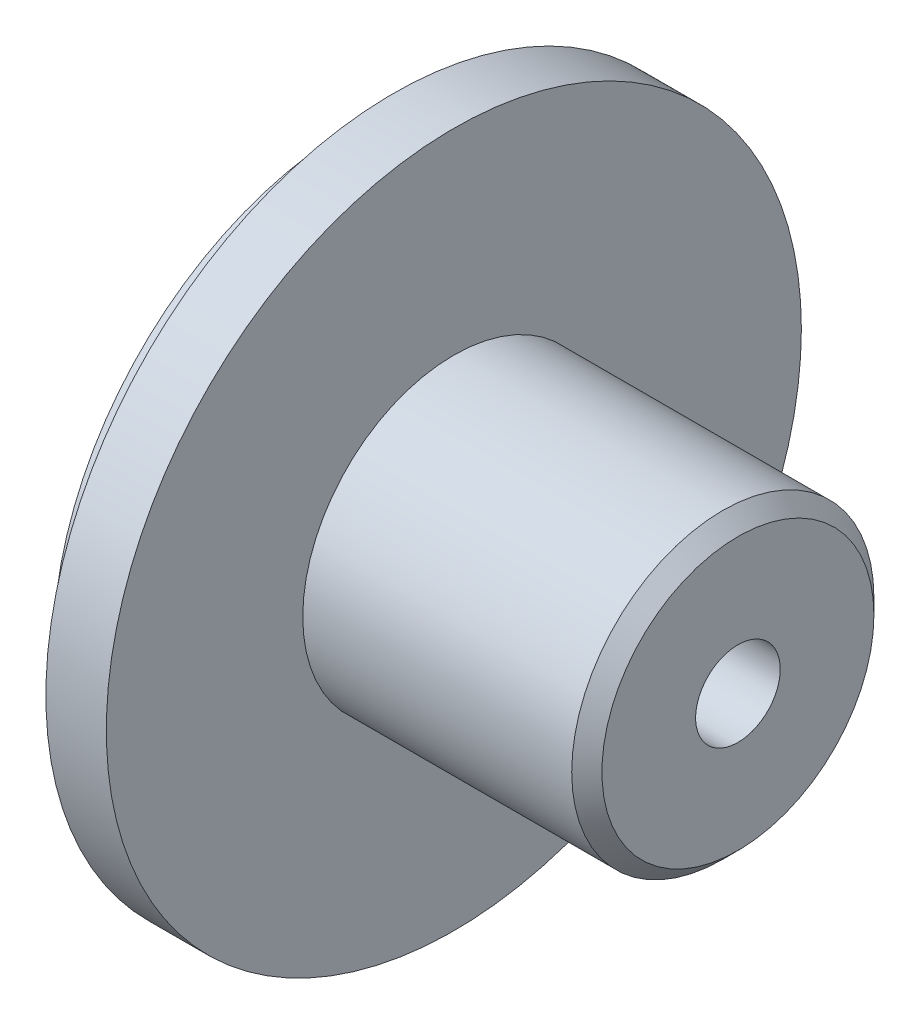
ISO-10303-21;
HEADER;
FILE_DESCRIPTION(('STEP AP214'),'2;1');
FILE_NAME('part.step','',(''),(''),'','','');
FILE_SCHEMA(('AUTOMOTIVE_DESIGN { 1 0 10303 214 1 1 1 1 }'));
ENDSEC;
DATA;
#1=APPLICATION_CONTEXT('core data for automotive mechanical design processes');
#2=APPLICATION_PROTOCOL_DEFINITION('international standard','automotive_design',2000,#1);
#3=PRODUCT_CONTEXT('',#1,'mechanical');
#4=PRODUCT('Part','Part','',(#3));
#5=PRODUCT_RELATED_PRODUCT_CATEGORY('part','',(#4));
#6=PRODUCT_DEFINITION_FORMATION('','',#4);
#7=PRODUCT_DEFINITION_CONTEXT('part definition',#1,'design');
#8=PRODUCT_DEFINITION('design','',#6,#7);
#9=PRODUCT_DEFINITION_SHAPE('','',#8);
#10=(LENGTH_UNIT() NAMED_UNIT(*) SI_UNIT(.MILLI.,.METRE.));
#11=(NAMED_UNIT(*) PLANE_ANGLE_UNIT() SI_UNIT($,.RADIAN.));
#12=(NAMED_UNIT(*) SI_UNIT($,.STERADIAN.) SOLID_ANGLE_UNIT());
#13=UNCERTAINTY_MEASURE_WITH_UNIT(LENGTH_MEASURE(1.E-05),#10,'distance_accuracy_value','');
#14=(GEOMETRIC_REPRESENTATION_CONTEXT(3) GLOBAL_UNCERTAINTY_ASSIGNED_CONTEXT((#13)) GLOBAL_UNIT_ASSIGNED_CONTEXT((#10,
#11,#12)) REPRESENTATION_CONTEXT('',''));
#15=CARTESIAN_POINT('',(0.,0.,0.));
#16=DIRECTION('',(0.,0.,1.));
#17=DIRECTION('',(1.,0.,0.));
#18=AXIS2_PLACEMENT_3D('',#15,#16,#17);
#19=CARTESIAN_POINT('',(-30.8,0.,0.));
#20=DIRECTION('',(1.,0.,0.));
#21=DIRECTION('',(0.,0.,1.));
#22=AXIS2_PLACEMENT_3D('',#19,#20,#21);
#23=PLANE('',#22);
#24=CARTESIAN_POINT('',(-30.8,0.,0.));
#25=DIRECTION('',(-1.,0.,0.));
#26=DIRECTION('',(0.,0.,-1.));
#27=AXIS2_PLACEMENT_3D('',#24,#25,#26);
#28=CIRCLE('',#27,1.6);
#29=CARTESIAN_POINT('',(-30.8,0.,-1.6));
#30=VERTEX_POINT('',#29);
#31=EDGE_CURVE('E9',#30,#30,#28,.T.);
#32=ORIENTED_EDGE('',*,*,#31,.F.);
#33=EDGE_LOOP('',(#32));
#34=FACE_BOUND('',#33,.T.);
#35=CARTESIAN_POINT('',(-30.8,0.,0.));
#36=DIRECTION('',(-1.,0.,0.));
#37=DIRECTION('',(0.,0.,-1.));
#38=AXIS2_PLACEMENT_3D('',#35,#36,#37);
#39=CIRCLE('',#38,9.95);
#40=CARTESIAN_POINT('',(-30.8,0.,-9.95));
#41=VERTEX_POINT('',#40);
#42=EDGE_CURVE('E87',#41,#41,#39,.T.);
#43=ORIENTED_EDGE('',*,*,#42,.T.);
#44=EDGE_LOOP('',(#43));
#45=FACE_BOUND('',#44,.T.);
#46=ADVANCED_FACE('F14',(#34,#45),#23,.F.);
#47=CARTESIAN_POINT('',(-30.9,0.,0.));
#48=DIRECTION('',(1.,0.,0.));
#49=DIRECTION('',(0.,0.,-1.));
#50=AXIS2_PLACEMENT_3D('',#47,#48,#49);
#51=CYLINDRICAL_SURFACE('',#50,1.6);
#52=DIRECTION('',(1.,0.,0.));
#53=VECTOR('',#52,1.);
#54=CARTESIAN_POINT('',(-30.9,0.,-1.6));
#55=LINE('',#54,#53);
#56=CARTESIAN_POINT('',(-27.5,0.,-1.6));
#57=VERTEX_POINT('',#56);
#58=EDGE_CURVE('E24',#30,#57,#55,.T.);
#59=ORIENTED_EDGE('',*,*,#58,.T.);
#60=CARTESIAN_POINT('',(-27.5,0.,0.));
#61=DIRECTION('',(-1.,0.,0.));
#62=DIRECTION('',(0.,0.,-1.));
#63=AXIS2_PLACEMENT_3D('',#60,#61,#62);
#64=CIRCLE('',#63,1.6);
#65=EDGE_CURVE('E89',#57,#57,#64,.T.);
#66=ORIENTED_EDGE('',*,*,#65,.F.);
#67=ORIENTED_EDGE('',*,*,#58,.F.);
#68=ORIENTED_EDGE('',*,*,#31,.T.);
#69=EDGE_LOOP('',(#59,#66,#67,#68));
#70=FACE_BOUND('',#69,.T.);
#71=ADVANCED_FACE('F163',(#70),#51,.F.);
#72=CARTESIAN_POINT('',(-30.8,0.,0.));
#73=DIRECTION('',(1.,0.,0.));
#74=DIRECTION('',(0.,0.,-1.));
#75=AXIS2_PLACEMENT_3D('',#72,#73,#74);
#76=CYLINDRICAL_SURFACE('',#75,9.95);
#77=DIRECTION('',(1.,0.,0.));
#78=VECTOR('',#77,1.);
#79=CARTESIAN_POINT('',(-30.8,0.,-9.95));
#80=LINE('',#79,#78);
#81=CARTESIAN_POINT('',(-29.5,0.,-9.95));
#82=VERTEX_POINT('',#81);
#83=EDGE_CURVE('E83',#41,#82,#80,.T.);
#84=ORIENTED_EDGE('',*,*,#83,.F.);
#85=ORIENTED_EDGE('',*,*,#42,.F.);
#86=ORIENTED_EDGE('',*,*,#83,.T.);
#87=CARTESIAN_POINT('',(-29.5,0.,0.));
#88=DIRECTION('',(-1.,0.,0.));
#89=DIRECTION('',(0.,0.,-1.));
#90=AXIS2_PLACEMENT_3D('',#87,#88,#89);
#91=CIRCLE('',#90,9.95);
#92=EDGE_CURVE('E86',#82,#82,#91,.T.);
#93=ORIENTED_EDGE('',*,*,#92,.T.);
#94=EDGE_LOOP('',(#84,#85,#86,#93));
#95=FACE_BOUND('',#94,.T.);
#96=ADVANCED_FACE('F84',(#95),#76,.T.);
#97=CARTESIAN_POINT('',(-27.5,0.,0.));
#98=DIRECTION('',(1.,0.,0.));
#99=DIRECTION('',(0.,0.,1.));
#100=AXIS2_PLACEMENT_3D('',#97,#98,#99);
#101=PLANE('',#100);
#102=CARTESIAN_POINT('',(-27.5,0.,0.));
#103=DIRECTION('',(-1.,0.,0.));
#104=DIRECTION('',(0.,0.,-1.));
#105=AXIS2_PLACEMENT_3D('',#102,#103,#104);
#106=CIRCLE('',#105,1.4);
#107=CARTESIAN_POINT('',(-27.5,0.,-1.4));
#108=VERTEX_POINT('',#107);
#109=EDGE_CURVE('E106',#108,#108,#106,.T.);
#110=ORIENTED_EDGE('',*,*,#109,.F.);
#111=EDGE_LOOP('',(#110));
#112=FACE_BOUND('',#111,.T.);
#113=ORIENTED_EDGE('',*,*,#65,.T.);
#114=EDGE_LOOP('',(#113));
#115=FACE_BOUND('',#114,.T.);
#116=ADVANCED_FACE('F171',(#112,#115),#101,.F.);
#117=CARTESIAN_POINT('',(-29.5,0.,0.));
#118=DIRECTION('',(1.,0.,0.));
#119=DIRECTION('',(0.,0.,1.));
#120=AXIS2_PLACEMENT_3D('',#117,#118,#119);
#121=PLANE('',#120);
#122=ORIENTED_EDGE('',*,*,#92,.F.);
#123=EDGE_LOOP('',(#122));
#124=FACE_BOUND('',#123,.T.);
#125=CARTESIAN_POINT('',(-29.5,0.,0.));
#126=DIRECTION('',(-1.,0.,0.));
#127=DIRECTION('',(0.,0.,-1.));
#128=AXIS2_PLACEMENT_3D('',#125,#126,#127);
#129=CIRCLE('',#128,11.5);
#130=CARTESIAN_POINT('',(-29.5,0.,-11.5));
#131=VERTEX_POINT('',#130);
#132=EDGE_CURVE('E73',#131,#131,#129,.T.);
#133=ORIENTED_EDGE('',*,*,#132,.T.);
#134=EDGE_LOOP('',(#133));
#135=FACE_BOUND('',#134,.T.);
#136=ADVANCED_FACE('F173',(#124,#135),#121,.F.);
#137=CARTESIAN_POINT('',(-27.51,0.,0.));
#138=DIRECTION('',(1.,0.,0.));
#139=DIRECTION('',(0.,0.,-1.));
#140=AXIS2_PLACEMENT_3D('',#137,#138,#139);
#141=CYLINDRICAL_SURFACE('',#140,1.4);
#142=CARTESIAN_POINT('',(-18.1,0.,0.));
#143=DIRECTION('',(-1.,0.,0.));
#144=DIRECTION('',(0.,0.,-1.));
#145=AXIS2_PLACEMENT_3D('',#142,#143,#144);
#146=CIRCLE('',#145,1.4);
#147=CARTESIAN_POINT('',(-18.1,0.,-1.4));
#148=VERTEX_POINT('',#147);
#149=EDGE_CURVE('E127',#148,#148,#146,.T.);
#150=ORIENTED_EDGE('',*,*,#149,.F.);
#151=DIRECTION('',(1.,0.,0.));
#152=VECTOR('',#151,1.);
#153=CARTESIAN_POINT('',(-27.51,0.,-1.4));
#154=LINE('',#153,#152);
#155=EDGE_CURVE('E17',#108,#148,#154,.T.);
#156=ORIENTED_EDGE('',*,*,#155,.F.);
#157=ORIENTED_EDGE('',*,*,#109,.T.);
#158=ORIENTED_EDGE('',*,*,#155,.T.);
#159=EDGE_LOOP('',(#150,#156,#157,#158));
#160=FACE_BOUND('',#159,.T.);
#161=ADVANCED_FACE('F159',(#160),#141,.F.);
#162=CARTESIAN_POINT('',(-29.5,0.,0.));
#163=DIRECTION('',(1.,0.,0.));
#164=DIRECTION('',(0.,0.,-1.));
#165=AXIS2_PLACEMENT_3D('',#162,#163,#164);
#166=CYLINDRICAL_SURFACE('',#165,11.5);
#167=DIRECTION('',(1.,0.,0.));
#168=VECTOR('',#167,1.);
#169=CARTESIAN_POINT('',(-29.5,0.,-11.5));
#170=LINE('',#169,#168);
#171=CARTESIAN_POINT('',(-27.5,0.,-11.5));
#172=VERTEX_POINT('',#171);
#173=EDGE_CURVE('E119',#131,#172,#170,.T.);
#174=ORIENTED_EDGE('',*,*,#173,.F.);
#175=ORIENTED_EDGE('',*,*,#132,.F.);
#176=ORIENTED_EDGE('',*,*,#173,.T.);
#177=CARTESIAN_POINT('',(-27.5,0.,0.));
#178=DIRECTION('',(-1.,0.,0.));
#179=DIRECTION('',(0.,0.,-1.));
#180=AXIS2_PLACEMENT_3D('',#177,#178,#179);
#181=CIRCLE('',#180,11.5);
#182=EDGE_CURVE('E128',#172,#172,#181,.T.);
#183=ORIENTED_EDGE('',*,*,#182,.T.);
#184=EDGE_LOOP('',(#174,#175,#176,#183));
#185=FACE_BOUND('',#184,.T.);
#186=ADVANCED_FACE('F149',(#185),#166,.T.);
#187=CARTESIAN_POINT('',(-18.1,0.,0.));
#188=DIRECTION('',(1.,0.,0.));
#189=DIRECTION('',(0.,0.,1.));
#190=AXIS2_PLACEMENT_3D('',#187,#188,#189);
#191=PLANE('',#190);
#192=ORIENTED_EDGE('',*,*,#149,.T.);
#193=EDGE_LOOP('',(#192));
#194=FACE_BOUND('',#193,.T.);
#195=CARTESIAN_POINT('',(-18.1,0.,0.));
#196=DIRECTION('',(-1.,0.,0.));
#197=DIRECTION('',(0.,0.,-1.));
#198=AXIS2_PLACEMENT_3D('',#195,#196,#197);
#199=CIRCLE('',#198,4.5);
#200=CARTESIAN_POINT('',(-18.1,0.,-4.5));
#201=VERTEX_POINT('',#200);
#202=EDGE_CURVE('E110',#201,#201,#199,.T.);
#203=ORIENTED_EDGE('',*,*,#202,.F.);
#204=EDGE_LOOP('',(#203));
#205=FACE_BOUND('',#204,.T.);
#206=ADVANCED_FACE('F146',(#194,#205),#191,.T.);
#207=CARTESIAN_POINT('',(-27.5,0.,0.));
#208=DIRECTION('',(1.,0.,0.));
#209=DIRECTION('',(0.,0.,1.));
#210=AXIS2_PLACEMENT_3D('',#207,#208,#209);
#211=PLANE('',#210);
#212=CARTESIAN_POINT('',(-27.5,0.,0.));
#213=DIRECTION('',(-1.,0.,0.));
#214=DIRECTION('',(0.,0.,-1.));
#215=AXIS2_PLACEMENT_3D('',#212,#213,#214);
#216=CIRCLE('',#215,5.);
#217=CARTESIAN_POINT('',(-27.5,0.,-5.));
#218=VERTEX_POINT('',#217);
#219=EDGE_CURVE('E113',#218,#218,#216,.T.);
#220=ORIENTED_EDGE('',*,*,#219,.T.);
#221=EDGE_LOOP('',(#220));
#222=FACE_BOUND('',#221,.T.);
#223=ORIENTED_EDGE('',*,*,#182,.F.);
#224=EDGE_LOOP('',(#223));
#225=FACE_BOUND('',#224,.T.);
#226=ADVANCED_FACE('F148',(#222,#225),#211,.T.);
#227=CARTESIAN_POINT('',(-18.6,0.,0.));
#228=DIRECTION('',(-1.,0.,0.));
#229=DIRECTION('',(0.,0.,-1.));
#230=AXIS2_PLACEMENT_3D('',#227,#228,#229);
#231=CONICAL_SURFACE('',#230,5.,0.785398163397);
#232=ORIENTED_EDGE('',*,*,#202,.T.);
#233=DIRECTION('',(0.707106781186548,0.,0.707106781186548));
#234=VECTOR('',#233,1.);
#235=CARTESIAN_POINT('',(-18.6,0.,-5.));
#236=LINE('',#235,#234);
#237=CARTESIAN_POINT('',(-18.6,0.,-5.));
#238=VERTEX_POINT('',#237);
#239=EDGE_CURVE('E99',#238,#201,#236,.T.);
#240=ORIENTED_EDGE('',*,*,#239,.F.);
#241=CARTESIAN_POINT('',(-18.6,0.,0.));
#242=DIRECTION('',(-1.,0.,0.));
#243=DIRECTION('',(0.,0.,-1.));
#244=AXIS2_PLACEMENT_3D('',#241,#242,#243);
#245=CIRCLE('',#244,5.);
#246=EDGE_CURVE('E107',#238,#238,#245,.T.);
#247=ORIENTED_EDGE('',*,*,#246,.F.);
#248=ORIENTED_EDGE('',*,*,#239,.T.);
#249=EDGE_LOOP('',(#232,#240,#247,#248));
#250=FACE_BOUND('',#249,.T.);
#251=ADVANCED_FACE('F144',(#250),#231,.T.);
#252=CARTESIAN_POINT('',(-27.51,0.,0.));
#253=DIRECTION('',(1.,0.,0.));
#254=DIRECTION('',(0.,0.,-1.));
#255=AXIS2_PLACEMENT_3D('',#252,#253,#254);
#256=CYLINDRICAL_SURFACE('',#255,5.);
#257=ORIENTED_EDGE('',*,*,#219,.F.);
#258=DIRECTION('',(1.,0.,0.));
#259=VECTOR('',#258,1.);
#260=CARTESIAN_POINT('',(-27.51,0.,-5.));
#261=LINE('',#260,#259);
#262=EDGE_CURVE('E111',#218,#238,#261,.T.);
#263=ORIENTED_EDGE('',*,*,#262,.T.);
#264=ORIENTED_EDGE('',*,*,#246,.T.);
#265=ORIENTED_EDGE('',*,*,#262,.F.);
#266=EDGE_LOOP('',(#257,#263,#264,#265));
#267=FACE_BOUND('',#266,.T.);
#268=ADVANCED_FACE('F188',(#267),#256,.T.);
#269=CLOSED_SHELL('',(#46,#71,#96,#116,#136,#161,#186,#206,#226,#251,#268));
#270=MANIFOLD_SOLID_BREP('B1',#269);
#271=ADVANCED_BREP_SHAPE_REPRESENTATION('',(#18,#270),#14);
#272=SHAPE_DEFINITION_REPRESENTATION(#9,#271);
ENDSEC;
END-ISO-10303-21;
